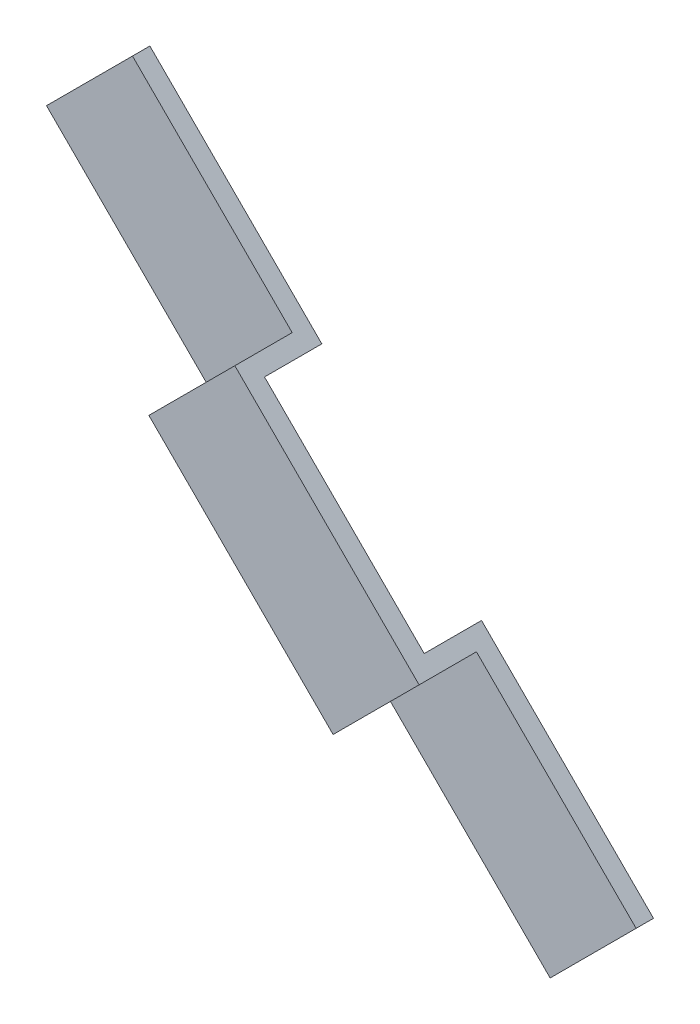
ISO-10303-21;
HEADER;
FILE_DESCRIPTION(('STEP AP214'),'2;1');
FILE_NAME('part.step','',(''),(''),'','','');
FILE_SCHEMA(('AUTOMOTIVE_DESIGN { 1 0 10303 214 1 1 1 1 }'));
ENDSEC;
DATA;
#1=APPLICATION_CONTEXT('core data for automotive mechanical design processes');
#2=APPLICATION_PROTOCOL_DEFINITION('international standard','automotive_design',2000,#1);
#3=PRODUCT_CONTEXT('',#1,'mechanical');
#4=PRODUCT('Part','Part','',(#3));
#5=PRODUCT_RELATED_PRODUCT_CATEGORY('part','',(#4));
#6=PRODUCT_DEFINITION_FORMATION('','',#4);
#7=PRODUCT_DEFINITION_CONTEXT('part definition',#1,'design');
#8=PRODUCT_DEFINITION('design','',#6,#7);
#9=PRODUCT_DEFINITION_SHAPE('','',#8);
#10=(LENGTH_UNIT() NAMED_UNIT(*) SI_UNIT(.MILLI.,.METRE.));
#11=(NAMED_UNIT(*) PLANE_ANGLE_UNIT() SI_UNIT($,.RADIAN.));
#12=(NAMED_UNIT(*) SI_UNIT($,.STERADIAN.) SOLID_ANGLE_UNIT());
#13=UNCERTAINTY_MEASURE_WITH_UNIT(LENGTH_MEASURE(1.E-05),#10,'distance_accuracy_value','');
#14=(GEOMETRIC_REPRESENTATION_CONTEXT(3) GLOBAL_UNCERTAINTY_ASSIGNED_CONTEXT((#13)) GLOBAL_UNIT_ASSIGNED_CONTEXT((#10,
#11,#12)) REPRESENTATION_CONTEXT('',''));
#15=CARTESIAN_POINT('',(0.,0.,0.));
#16=DIRECTION('',(0.,0.,1.));
#17=DIRECTION('',(1.,0.,0.));
#18=AXIS2_PLACEMENT_3D('',#15,#16,#17);
#19=CARTESIAN_POINT('',(-10.7809065038693,-13.3028898857297,2.41331608762142));
#20=CARTESIAN_POINT('',(-10.1869368076726,-12.708920189533,2.41331608762142));
#21=CARTESIAN_POINT('',(-10.7809065161091,-13.3028898734899,2.01731608762142));
#22=CARTESIAN_POINT('',(-10.1869368199124,-12.7089201772932,2.01731608762142));
#23=(BOUNDED_SURFACE() B_SPLINE_SURFACE(1,1,((#19,#20),(#21,#22)),.UNSPECIFIED.,.F.,.F.,
.F.) B_SPLINE_SURFACE_WITH_KNOTS((2,2),(2,2),(-3.3E-05,0.000363),(-7.0000000000072E-05,
0.00076999999999996),
.UNSPECIFIED.) GEOMETRIC_REPRESENTATION_ITEM() RATIONAL_B_SPLINE_SURFACE(((1.,1.),(1.,1.))) REPRESENTATION_ITEM('') SURFACE());
#24=CARTESIAN_POINT('',(-10.7314090404061,-13.2533923998268,2.05031608762142));
#25=CARTESIAN_POINT('',(-10.7314090302062,-13.2533924100266,2.38031608762142));
#26=(BOUNDED_CURVE() B_SPLINE_CURVE(1,(#24,#25),.UNSPECIFIED.,.F.,
.F.) B_SPLINE_CURVE_WITH_KNOTS((2,2),(0.,0.00033),
.UNSPECIFIED.) CURVE() GEOMETRIC_REPRESENTATION_ITEM() RATIONAL_B_SPLINE_CURVE((1.,1.)) REPRESENTATION_ITEM(''));
#27=CARTESIAN_POINT('',(-10.7314090404061,-13.2533923998268,2.05031608762142));
#28=VERTEX_POINT('',#27);
#29=CARTESIAN_POINT('',(-10.7314090302062,-13.2533924100266,2.38031608762142));
#30=VERTEX_POINT('',#29);
#31=EDGE_CURVE('E204',#28,#30,#26,.T.);
#32=CARTESIAN_POINT('',(-10.7314090404061,-13.2533923998268,2.05031608762142));
#33=CARTESIAN_POINT('',(-10.2364342935755,-12.7584176529962,2.05031608762142));
#34=(BOUNDED_CURVE() B_SPLINE_CURVE(1,(#32,#33),.UNSPECIFIED.,.F.,
.F.) B_SPLINE_CURVE_WITH_KNOTS((2,2),(0.,0.000700000000000023),
.UNSPECIFIED.) CURVE() GEOMETRIC_REPRESENTATION_ITEM() RATIONAL_B_SPLINE_CURVE((1.,1.)) REPRESENTATION_ITEM(''));
#35=CARTESIAN_POINT('',(-10.2364342935755,-12.7584176529962,2.05031608762142));
#36=VERTEX_POINT('',#35);
#37=EDGE_CURVE('E330',#28,#36,#34,.T.);
#38=CARTESIAN_POINT('',(-10.2364342833757,-12.758417663196,2.38031608762142));
#39=CARTESIAN_POINT('',(-10.2364342935755,-12.7584176529962,2.05031608762142));
#40=(BOUNDED_CURVE() B_SPLINE_CURVE(1,(#38,#39),.UNSPECIFIED.,.F.,
.F.) B_SPLINE_CURVE_WITH_KNOTS((2,2),(-0.00033,0.),
.UNSPECIFIED.) CURVE() GEOMETRIC_REPRESENTATION_ITEM() RATIONAL_B_SPLINE_CURVE((1.,1.)) REPRESENTATION_ITEM(''));
#41=CARTESIAN_POINT('',(-10.2364342833757,-12.758417663196,2.38031608762142));
#42=VERTEX_POINT('',#41);
#43=EDGE_CURVE('E115',#42,#36,#40,.T.);
#44=CARTESIAN_POINT('',(-10.7314090302062,-13.2533924100266,2.38031608762142));
#45=CARTESIAN_POINT('',(-10.2364342833757,-12.7584176631961,2.38031608762142));
#46=(BOUNDED_CURVE() B_SPLINE_CURVE(1,(#44,#45),.UNSPECIFIED.,.F.,
.F.) B_SPLINE_CURVE_WITH_KNOTS((2,2),(0.,0.000699999999999953),
.UNSPECIFIED.) CURVE() GEOMETRIC_REPRESENTATION_ITEM() RATIONAL_B_SPLINE_CURVE((1.,1.)) REPRESENTATION_ITEM(''));
#47=EDGE_CURVE('E11',#30,#42,#46,.T.);
#48=ORIENTED_EDGE('',*,*,#31,.F.);
#49=ORIENTED_EDGE('',*,*,#37,.T.);
#50=ORIENTED_EDGE('',*,*,#43,.F.);
#51=ORIENTED_EDGE('',*,*,#47,.F.);
#52=EDGE_LOOP('',(#48,#49,#50,#51));
#53=FACE_BOUND('',#52,.T.);
#54=ADVANCED_FACE('F17',(#53),#23,.T.);
#55=CARTESIAN_POINT('',(-9.76974380779254,-14.3140525818064,2.3803160251141));
#56=CARTESIAN_POINT('',(-9.17577411159583,-13.7200828856097,2.3803160251141));
#57=CARTESIAN_POINT('',(-10.8728303864436,-13.2109660031554,2.3803160933039));
#58=CARTESIAN_POINT('',(-10.2788606902469,-12.6169963069587,2.3803160933039));
#59=(BOUNDED_SURFACE() B_SPLINE_SURFACE(1,1,((#55,#56),(#57,#58)),.UNSPECIFIED.,.F.,.F.,
.F.) B_SPLINE_SURFACE_WITH_KNOTS((2,2),(2,2),(-0.000130000000000005,0.00143000000000004),
(-7.0000000000001E-05,0.000770000000000011),
.UNSPECIFIED.) GEOMETRIC_REPRESENTATION_ITEM() RATIONAL_B_SPLINE_SURFACE(((1.,1.),(1.,1.))) REPRESENTATION_ITEM('') SURFACE());
#60=CARTESIAN_POINT('',(-10.7314090302062,-13.2533924100266,2.38031608762142));
#61=CARTESIAN_POINT('',(-9.81217021466372,-14.1726312255691,2.38031603079659));
#62=(BOUNDED_CURVE() B_SPLINE_CURVE(1,(#60,#61),.UNSPECIFIED.,.F.,
.F.) B_SPLINE_CURVE_WITH_KNOTS((2,2),(0.,0.00129999999999996),
.UNSPECIFIED.) CURVE() GEOMETRIC_REPRESENTATION_ITEM() RATIONAL_B_SPLINE_CURVE((1.,1.)) REPRESENTATION_ITEM(''));
#63=CARTESIAN_POINT('',(-9.81217021466373,-14.1726312255691,2.38031603079658));
#64=VERTEX_POINT('',#63);
#65=EDGE_CURVE('E194',#30,#64,#62,.T.);
#66=CARTESIAN_POINT('',(-9.31719546783318,-13.6776564787385,2.38031603079659));
#67=CARTESIAN_POINT('',(-10.2364342833757,-12.758417663196,2.38031608762142));
#68=(BOUNDED_CURVE() B_SPLINE_CURVE(1,(#66,#67),.UNSPECIFIED.,.F.,
.F.) B_SPLINE_CURVE_WITH_KNOTS((2,2),(-0.00130000000000002,0.),
.UNSPECIFIED.) CURVE() GEOMETRIC_REPRESENTATION_ITEM() RATIONAL_B_SPLINE_CURVE((1.,1.)) REPRESENTATION_ITEM(''));
#69=CARTESIAN_POINT('',(-9.31719546783315,-13.6776564787385,2.38031603079658));
#70=VERTEX_POINT('',#69);
#71=EDGE_CURVE('E23',#70,#42,#68,.T.);
#72=CARTESIAN_POINT('',(-9.81217021466373,-14.1726312255691,2.38031603079658));
#73=CARTESIAN_POINT('',(-9.31719546783314,-13.6776564787385,2.38031603079658));
#74=(BOUNDED_CURVE() B_SPLINE_CURVE(1,(#72,#73),.UNSPECIFIED.,.F.,
.F.) B_SPLINE_CURVE_WITH_KNOTS((2,2),(0.,0.000700000000000009),
.UNSPECIFIED.) CURVE() GEOMETRIC_REPRESENTATION_ITEM() RATIONAL_B_SPLINE_CURVE((1.,1.)) REPRESENTATION_ITEM(''));
#75=EDGE_CURVE('E32',#64,#70,#74,.T.);
#76=ORIENTED_EDGE('',*,*,#65,.F.);
#77=ORIENTED_EDGE('',*,*,#47,.T.);
#78=ORIENTED_EDGE('',*,*,#71,.F.);
#79=ORIENTED_EDGE('',*,*,#75,.F.);
#80=EDGE_LOOP('',(#76,#77,#78,#79));
#81=FACE_BOUND('',#80,.T.);
#82=ADVANCED_FACE('F110',(#81),#59,.T.);
#83=CARTESIAN_POINT('',(-9.86166770056663,-14.2221286890324,2.01731603079658));
#84=CARTESIAN_POINT('',(-9.26769800436989,-13.6281589928356,2.01731603079658));
#85=CARTESIAN_POINT('',(-9.86166768832681,-14.2221287012722,2.41331603079658));
#86=CARTESIAN_POINT('',(-9.26769799213007,-13.6281590050755,2.41331603079658));
#87=(BOUNDED_SURFACE() B_SPLINE_SURFACE(1,1,((#83,#84),(#85,#86)),.UNSPECIFIED.,.F.,.F.,
.F.) B_SPLINE_SURFACE_WITH_KNOTS((2,2),(2,2),(-3.30000000000005E-05,0.000363),
(-7.00000000000048E-05,0.000770000000000053),
.UNSPECIFIED.) GEOMETRIC_REPRESENTATION_ITEM() RATIONAL_B_SPLINE_SURFACE(((1.,1.),(1.,1.))) REPRESENTATION_ITEM('') SURFACE());
#88=CARTESIAN_POINT('',(-9.81217021466373,-14.1726312255691,2.38031603079658));
#89=CARTESIAN_POINT('',(-9.81217022486358,-14.1726312153692,2.05031603079658));
#90=(BOUNDED_CURVE() B_SPLINE_CURVE(1,(#88,#89),.UNSPECIFIED.,.F.,
.F.) B_SPLINE_CURVE_WITH_KNOTS((2,2),(0.,0.00033),
.UNSPECIFIED.) CURVE() GEOMETRIC_REPRESENTATION_ITEM() RATIONAL_B_SPLINE_CURVE((1.,1.)) REPRESENTATION_ITEM(''));
#91=CARTESIAN_POINT('',(-9.81217022486358,-14.1726312153693,2.05031603079658));
#92=VERTEX_POINT('',#91);
#93=EDGE_CURVE('E102',#64,#92,#90,.T.);
#94=CARTESIAN_POINT('',(-9.317195478033,-13.6776564685387,2.05031603079658));
#95=CARTESIAN_POINT('',(-9.31719546783315,-13.6776564787385,2.38031603079658));
#96=(BOUNDED_CURVE() B_SPLINE_CURVE(1,(#94,#95),.UNSPECIFIED.,.F.,
.F.) B_SPLINE_CURVE_WITH_KNOTS((2,2),(-0.00033,0.),
.UNSPECIFIED.) CURVE() GEOMETRIC_REPRESENTATION_ITEM() RATIONAL_B_SPLINE_CURVE((1.,1.)) REPRESENTATION_ITEM(''));
#97=CARTESIAN_POINT('',(-9.31719547803299,-13.6776564685387,2.05031603079658));
#98=VERTEX_POINT('',#97);
#99=EDGE_CURVE('E99',#98,#70,#96,.T.);
#100=CARTESIAN_POINT('',(-9.81217022486358,-14.1726312153693,2.05031603079658));
#101=CARTESIAN_POINT('',(-9.31719547803299,-13.6776564685387,2.05031603079658));
#102=(BOUNDED_CURVE() B_SPLINE_CURVE(1,(#100,#101),.UNSPECIFIED.,.F.,
.F.) B_SPLINE_CURVE_WITH_KNOTS((2,2),(0.,0.000700000000000015),
.UNSPECIFIED.) CURVE() GEOMETRIC_REPRESENTATION_ITEM() RATIONAL_B_SPLINE_CURVE((1.,1.)) REPRESENTATION_ITEM(''));
#103=EDGE_CURVE('E107',#92,#98,#102,.T.);
#104=ORIENTED_EDGE('',*,*,#93,.F.);
#105=ORIENTED_EDGE('',*,*,#75,.T.);
#106=ORIENTED_EDGE('',*,*,#99,.F.);
#107=ORIENTED_EDGE('',*,*,#103,.F.);
#108=EDGE_LOOP('',(#104,#105,#106,#107));
#109=FACE_BOUND('',#108,.T.);
#110=ADVANCED_FACE('F97',(#109),#87,.T.);
#111=CARTESIAN_POINT('',(-8.77272325651935,-15.3110731330797,2.05031596348102));
#112=CARTESIAN_POINT('',(-8.17875356032262,-14.717103436883,2.05031596348102));
#113=CARTESIAN_POINT('',(-9.96066264891278,-14.1231337406863,2.05031603691619));
#114=CARTESIAN_POINT('',(-9.36669295271605,-13.5291640444895,2.05031603691619));
#115=(BOUNDED_SURFACE() B_SPLINE_SURFACE(1,1,((#111,#112),(#113,#114)),.UNSPECIFIED.,.F.,.F.,
.F.) B_SPLINE_SURFACE_WITH_KNOTS((2,2),(2,2),(-0.000140000000000004,0.00154000000000004),
(-7.00000000000037E-05,0.000770000000000041),
.UNSPECIFIED.) GEOMETRIC_REPRESENTATION_ITEM() RATIONAL_B_SPLINE_SURFACE(((1.,1.),(1.,1.))) REPRESENTATION_ITEM('') SURFACE());
#116=CARTESIAN_POINT('',(-9.81217022486358,-14.1726312153693,2.05031603079658));
#117=CARTESIAN_POINT('',(-8.8222207312024,-15.1625807090305,2.05031596960061));
#118=(BOUNDED_CURVE() B_SPLINE_CURVE(1,(#116,#117),.UNSPECIFIED.,.F.,
.F.) B_SPLINE_CURVE_WITH_KNOTS((2,2),(0.,0.00140000000000003),
.UNSPECIFIED.) CURVE() GEOMETRIC_REPRESENTATION_ITEM() RATIONAL_B_SPLINE_CURVE((1.,1.)) REPRESENTATION_ITEM(''));
#119=CARTESIAN_POINT('',(-8.82222073120241,-15.1625807090305,2.05031596960062));
#120=VERTEX_POINT('',#119);
#121=EDGE_CURVE('E193',#92,#120,#118,.T.);
#122=CARTESIAN_POINT('',(-8.32724598437181,-14.6676059621999,2.05031596960061));
#123=CARTESIAN_POINT('',(-9.31719547803299,-13.6776564685387,2.05031603079658));
#124=(BOUNDED_CURVE() B_SPLINE_CURVE(1,(#122,#123),.UNSPECIFIED.,.F.,
.F.) B_SPLINE_CURVE_WITH_KNOTS((2,2),(-0.00140000000000002,0.),
.UNSPECIFIED.) CURVE() GEOMETRIC_REPRESENTATION_ITEM() RATIONAL_B_SPLINE_CURVE((1.,1.)) REPRESENTATION_ITEM(''));
#125=CARTESIAN_POINT('',(-8.32724598437183,-14.6676059621999,2.05031596960062));
#126=VERTEX_POINT('',#125);
#127=EDGE_CURVE('E120',#126,#98,#124,.T.);
#128=CARTESIAN_POINT('',(-8.82222073120241,-15.1625807090305,2.05031596960062));
#129=CARTESIAN_POINT('',(-8.32724598437182,-14.6676059621999,2.05031596960062));
#130=(BOUNDED_CURVE() B_SPLINE_CURVE(1,(#128,#129),.UNSPECIFIED.,.F.,
.F.) B_SPLINE_CURVE_WITH_KNOTS((2,2),(0.,0.000700000000000011),
.UNSPECIFIED.) CURVE() GEOMETRIC_REPRESENTATION_ITEM() RATIONAL_B_SPLINE_CURVE((1.,1.)) REPRESENTATION_ITEM(''));
#131=EDGE_CURVE('E251',#120,#126,#130,.T.);
#132=ORIENTED_EDGE('',*,*,#121,.F.);
#133=ORIENTED_EDGE('',*,*,#103,.T.);
#134=ORIENTED_EDGE('',*,*,#127,.F.);
#135=ORIENTED_EDGE('',*,*,#131,.F.);
#136=EDGE_LOOP('',(#132,#133,#134,#135));
#137=FACE_BOUND('',#136,.T.);
#138=ADVANCED_FACE('F368',(#137),#115,.T.);
#139=CARTESIAN_POINT('',(-8.87171820248556,-15.2120781871135,2.16031596960061));
#140=CARTESIAN_POINT('',(-8.27774850628881,-14.6181084909167,2.16031596960061));
#141=CARTESIAN_POINT('',(-8.87171820619459,-15.2120781834044,2.04031596960062));
#142=CARTESIAN_POINT('',(-8.27774850999784,-14.6181084872077,2.04031596960062));
#143=(BOUNDED_SURFACE() B_SPLINE_SURFACE(1,1,((#139,#140),(#141,#142)),.UNSPECIFIED.,.F.,.F.,
.F.) B_SPLINE_SURFACE_WITH_KNOTS((2,2),(2,2),(-9.99999999999916E-06,0.00010999999999999),
(-7.00000000000501E-05,0.000770000000000023),
.UNSPECIFIED.) GEOMETRIC_REPRESENTATION_ITEM() RATIONAL_B_SPLINE_SURFACE(((1.,1.),(1.,1.))) REPRESENTATION_ITEM('') SURFACE());
#144=CARTESIAN_POINT('',(-8.82222073120241,-15.1625807090305,2.05031596960062));
#145=CARTESIAN_POINT('',(-8.82222072811155,-15.1625807121214,2.15031596960061));
#146=(BOUNDED_CURVE() B_SPLINE_CURVE(1,(#144,#145),.UNSPECIFIED.,.F.,
.F.) B_SPLINE_CURVE_WITH_KNOTS((2,2),(0.,9.99999999999904E-05),
.UNSPECIFIED.) CURVE() GEOMETRIC_REPRESENTATION_ITEM() RATIONAL_B_SPLINE_CURVE((1.,1.)) REPRESENTATION_ITEM(''));
#147=CARTESIAN_POINT('',(-8.82222072811155,-15.1625807121213,2.15031596960061));
#148=VERTEX_POINT('',#147);
#149=EDGE_CURVE('E144',#120,#148,#146,.T.);
#150=CARTESIAN_POINT('',(-8.32724598128097,-14.6676059652908,2.15031596960061));
#151=CARTESIAN_POINT('',(-8.32724598437183,-14.6676059621999,2.05031596960062));
#152=(BOUNDED_CURVE() B_SPLINE_CURVE(1,(#150,#151),.UNSPECIFIED.,.F.,
.F.) B_SPLINE_CURVE_WITH_KNOTS((2,2),(-9.99999999999904E-05,0.),
.UNSPECIFIED.) CURVE() GEOMETRIC_REPRESENTATION_ITEM() RATIONAL_B_SPLINE_CURVE((1.,1.)) REPRESENTATION_ITEM(''));
#153=CARTESIAN_POINT('',(-8.32724598128096,-14.6676059652907,2.15031596960061));
#154=VERTEX_POINT('',#153);
#155=EDGE_CURVE('E127',#154,#126,#152,.T.);
#156=CARTESIAN_POINT('',(-8.82222072811155,-15.1625807121213,2.15031596960061));
#157=CARTESIAN_POINT('',(-8.32724598128095,-14.6676059652907,2.15031596960061));
#158=(BOUNDED_CURVE() B_SPLINE_CURVE(1,(#156,#157),.UNSPECIFIED.,.F.,
.F.) B_SPLINE_CURVE_WITH_KNOTS((2,2),(0.,0.000700000000000016),
.UNSPECIFIED.) CURVE() GEOMETRIC_REPRESENTATION_ITEM() RATIONAL_B_SPLINE_CURVE((1.,1.)) REPRESENTATION_ITEM(''));
#159=EDGE_CURVE('E175',#148,#154,#158,.T.);
#160=ORIENTED_EDGE('',*,*,#149,.F.);
#161=ORIENTED_EDGE('',*,*,#131,.T.);
#162=ORIENTED_EDGE('',*,*,#155,.F.);
#163=ORIENTED_EDGE('',*,*,#159,.F.);
#164=EDGE_LOOP('',(#160,#161,#162,#163));
#165=FACE_BOUND('',#164,.T.);
#166=ADVANCED_FACE('F19',(#165),#143,.T.);
#167=CARTESIAN_POINT('',(-9.88288089989138,-14.2009154897076,2.15031603210792));
#168=CARTESIAN_POINT('',(-9.28891120369465,-13.6069457935109,2.15031603210792));
#169=CARTESIAN_POINT('',(-8.77979432124037,-15.3040020683586,2.15031596391812));
#170=CARTESIAN_POINT('',(-8.18582462504364,-14.7100323721619,2.15031596391812));
#171=(BOUNDED_SURFACE() B_SPLINE_SURFACE(1,1,((#167,#168),(#169,#170)),.UNSPECIFIED.,.F.,.F.,
.F.) B_SPLINE_SURFACE_WITH_KNOTS((2,2),(2,2),(-0.000130000000000008,0.00143),
(-7.00000000000026E-05,0.000770000000000029),
.UNSPECIFIED.) GEOMETRIC_REPRESENTATION_ITEM() RATIONAL_B_SPLINE_SURFACE(((1.,1.),(1.,1.))) REPRESENTATION_ITEM('') SURFACE());
#172=CARTESIAN_POINT('',(-8.82222072811155,-15.1625807121213,2.15031596960061));
#173=CARTESIAN_POINT('',(-9.74145954365405,-14.2433418965788,2.15031602642544));
#174=(BOUNDED_CURVE() B_SPLINE_CURVE(1,(#172,#173),.UNSPECIFIED.,.F.,
.F.) B_SPLINE_CURVE_WITH_KNOTS((2,2),(0.,0.0013),
.UNSPECIFIED.) CURVE() GEOMETRIC_REPRESENTATION_ITEM() RATIONAL_B_SPLINE_CURVE((1.,1.)) REPRESENTATION_ITEM(''));
#175=CARTESIAN_POINT('',(-9.74145954365406,-14.2433418965788,2.15031602642544));
#176=VERTEX_POINT('',#175);
#177=EDGE_CURVE('E136',#148,#176,#174,.T.);
#178=CARTESIAN_POINT('',(-9.24648479682346,-13.7483671497482,2.15031602642544));
#179=CARTESIAN_POINT('',(-8.32724598128096,-14.6676059652907,2.15031596960061));
#180=(BOUNDED_CURVE() B_SPLINE_CURVE(1,(#178,#179),.UNSPECIFIED.,.F.,
.F.) B_SPLINE_CURVE_WITH_KNOTS((2,2),(-0.0013,0.),
.UNSPECIFIED.) CURVE() GEOMETRIC_REPRESENTATION_ITEM() RATIONAL_B_SPLINE_CURVE((1.,1.)) REPRESENTATION_ITEM(''));
#181=CARTESIAN_POINT('',(-9.24648479682347,-13.7483671497482,2.15031602642544));
#182=VERTEX_POINT('',#181);
#183=EDGE_CURVE('E241',#182,#154,#180,.T.);
#184=CARTESIAN_POINT('',(-9.74145954365406,-14.2433418965788,2.15031602642544));
#185=CARTESIAN_POINT('',(-9.24648479682346,-13.7483671497482,2.15031602642544));
#186=(BOUNDED_CURVE() B_SPLINE_CURVE(1,(#184,#185),.UNSPECIFIED.,.F.,
.F.) B_SPLINE_CURVE_WITH_KNOTS((2,2),(0.,0.000700000000000018),
.UNSPECIFIED.) CURVE() GEOMETRIC_REPRESENTATION_ITEM() RATIONAL_B_SPLINE_CURVE((1.,1.)) REPRESENTATION_ITEM(''));
#187=EDGE_CURVE('E167',#176,#182,#186,.T.);
#188=ORIENTED_EDGE('',*,*,#177,.F.);
#189=ORIENTED_EDGE('',*,*,#159,.T.);
#190=ORIENTED_EDGE('',*,*,#183,.F.);
#191=ORIENTED_EDGE('',*,*,#187,.F.);
#192=EDGE_LOOP('',(#188,#189,#190,#191));
#193=FACE_BOUND('',#192,.T.);
#194=ADVANCED_FACE('F373',(#193),#171,.T.);
#195=CARTESIAN_POINT('',(-9.79095700711731,-14.2928393824817,2.51331602642544));
#196=CARTESIAN_POINT('',(-9.19698731092059,-13.698869686285,2.51331602642544));
#197=CARTESIAN_POINT('',(-9.79095701935713,-14.2928393702419,2.11731602642544));
#198=CARTESIAN_POINT('',(-9.19698732316041,-13.6988696740451,2.11731602642544));
#199=(BOUNDED_SURFACE() B_SPLINE_SURFACE(1,1,((#195,#196),(#197,#198)),.UNSPECIFIED.,.F.,.F.,
.F.) B_SPLINE_SURFACE_WITH_KNOTS((2,2),(2,2),(-3.3E-05,0.000363),(-7.00000000000393E-05,
0.000769999999999988),
.UNSPECIFIED.) GEOMETRIC_REPRESENTATION_ITEM() RATIONAL_B_SPLINE_SURFACE(((1.,1.),(1.,1.))) REPRESENTATION_ITEM('') SURFACE());
#200=CARTESIAN_POINT('',(-9.74145954365406,-14.2433418965788,2.15031602642544));
#201=CARTESIAN_POINT('',(-9.74145953345421,-14.2433419067786,2.48031602642544));
#202=(BOUNDED_CURVE() B_SPLINE_CURVE(1,(#200,#201),.UNSPECIFIED.,.F.,
.F.) B_SPLINE_CURVE_WITH_KNOTS((2,2),(0.,0.00033),
.UNSPECIFIED.) CURVE() GEOMETRIC_REPRESENTATION_ITEM() RATIONAL_B_SPLINE_CURVE((1.,1.)) REPRESENTATION_ITEM(''));
#203=CARTESIAN_POINT('',(-9.74145953345421,-14.2433419067786,2.48031602642544));
#204=VERTEX_POINT('',#203);
#205=EDGE_CURVE('E133',#176,#204,#202,.T.);
#206=CARTESIAN_POINT('',(-9.24648478662362,-13.748367159948,2.48031602642544));
#207=CARTESIAN_POINT('',(-9.24648479682347,-13.7483671497482,2.15031602642544));
#208=(BOUNDED_CURVE() B_SPLINE_CURVE(1,(#206,#207),.UNSPECIFIED.,.F.,
.F.) B_SPLINE_CURVE_WITH_KNOTS((2,2),(-0.00033,0.),
.UNSPECIFIED.) CURVE() GEOMETRIC_REPRESENTATION_ITEM() RATIONAL_B_SPLINE_CURVE((1.,1.)) REPRESENTATION_ITEM(''));
#209=CARTESIAN_POINT('',(-9.24648478662363,-13.7483671599481,2.48031602642544));
#210=VERTEX_POINT('',#209);
#211=EDGE_CURVE('E232',#210,#182,#208,.T.);
#212=CARTESIAN_POINT('',(-9.74145953345421,-14.2433419067786,2.48031602642544));
#213=CARTESIAN_POINT('',(-9.24648478662367,-13.7483671599481,2.48031602642544));
#214=(BOUNDED_CURVE() B_SPLINE_CURVE(1,(#212,#213),.UNSPECIFIED.,.F.,
.F.) B_SPLINE_CURVE_WITH_KNOTS((2,2),(0.,0.000699999999999939),
.UNSPECIFIED.) CURVE() GEOMETRIC_REPRESENTATION_ITEM() RATIONAL_B_SPLINE_CURVE((1.,1.)) REPRESENTATION_ITEM(''));
#215=EDGE_CURVE('E176',#204,#210,#214,.T.);
#216=ORIENTED_EDGE('',*,*,#205,.F.);
#217=ORIENTED_EDGE('',*,*,#187,.T.);
#218=ORIENTED_EDGE('',*,*,#211,.F.);
#219=ORIENTED_EDGE('',*,*,#215,.F.);
#220=EDGE_LOOP('',(#216,#217,#218,#219));
#221=FACE_BOUND('',#220,.T.);
#222=ADVANCED_FACE('F526',(#221),#199,.T.);
#223=CARTESIAN_POINT('',(-10.957683197095,-13.1261131925039,2.48031609854927));
#224=CARTESIAN_POINT('',(-10.3637135008983,-12.5321434963072,2.48031609854927));
#225=CARTESIAN_POINT('',(-9.68489099095925,-14.3989053986397,2.48031601986873));
#226=CARTESIAN_POINT('',(-9.09092129476252,-13.804935702443,2.48031601986873));
#227=(BOUNDED_SURFACE() B_SPLINE_SURFACE(1,1,((#223,#224),(#225,#226)),.UNSPECIFIED.,.F.,.F.,
.F.) B_SPLINE_SURFACE_WITH_KNOTS((2,2),(2,2),(-0.000150000000000003,0.00165),
(-7.00000000000096E-05,0.00077000000000003),
.UNSPECIFIED.) GEOMETRIC_REPRESENTATION_ITEM() RATIONAL_B_SPLINE_SURFACE(((1.,1.),(1.,1.))) REPRESENTATION_ITEM('') SURFACE());
#228=CARTESIAN_POINT('',(-9.74145953345421,-14.2433419067786,2.48031602642544));
#229=CARTESIAN_POINT('',(-10.802119705234,-13.1826817349988,2.48031609199256));
#230=(BOUNDED_CURVE() B_SPLINE_CURVE(1,(#228,#229),.UNSPECIFIED.,.F.,
.F.) B_SPLINE_CURVE_WITH_KNOTS((2,2),(0.,0.00149999999999996),
.UNSPECIFIED.) CURVE() GEOMETRIC_REPRESENTATION_ITEM() RATIONAL_B_SPLINE_CURVE((1.,1.)) REPRESENTATION_ITEM(''));
#231=CARTESIAN_POINT('',(-10.802119705234,-13.1826817349988,2.48031609199256));
#232=VERTEX_POINT('',#231);
#233=EDGE_CURVE('E824',#204,#232,#230,.T.);
#234=CARTESIAN_POINT('',(-10.3071449584035,-12.6877069881683,2.48031609199256));
#235=CARTESIAN_POINT('',(-9.24648478662363,-13.7483671599481,2.48031602642544));
#236=(BOUNDED_CURVE() B_SPLINE_CURVE(1,(#234,#235),.UNSPECIFIED.,.F.,
.F.) B_SPLINE_CURVE_WITH_KNOTS((2,2),(-0.0015,0.),
.UNSPECIFIED.) CURVE() GEOMETRIC_REPRESENTATION_ITEM() RATIONAL_B_SPLINE_CURVE((1.,1.)) REPRESENTATION_ITEM(''));
#237=CARTESIAN_POINT('',(-10.3071449584034,-12.6877069881682,2.48031609199256));
#238=VERTEX_POINT('',#237);
#239=EDGE_CURVE('E242',#238,#210,#236,.T.);
#240=CARTESIAN_POINT('',(-10.802119705234,-13.1826817349988,2.48031609199256));
#241=CARTESIAN_POINT('',(-10.3071449584034,-12.6877069881682,2.48031609199256));
#242=(BOUNDED_CURVE() B_SPLINE_CURVE(1,(#240,#241),.UNSPECIFIED.,.F.,
.F.) B_SPLINE_CURVE_WITH_KNOTS((2,2),(0.,0.000700000000000025),
.UNSPECIFIED.) CURVE() GEOMETRIC_REPRESENTATION_ITEM() RATIONAL_B_SPLINE_CURVE((1.,1.)) REPRESENTATION_ITEM(''));
#243=EDGE_CURVE('E231',#232,#238,#242,.T.);
#244=ORIENTED_EDGE('',*,*,#233,.F.);
#245=ORIENTED_EDGE('',*,*,#215,.T.);
#246=ORIENTED_EDGE('',*,*,#239,.F.);
#247=ORIENTED_EDGE('',*,*,#243,.F.);
#248=EDGE_LOOP('',(#244,#245,#246,#247));
#249=FACE_BOUND('',#248,.T.);
#250=ADVANCED_FACE('F496',(#249),#227,.T.);
#251=CARTESIAN_POINT('',(-10.8516171911369,-13.2321791984621,2.11731609199256));
#252=CARTESIAN_POINT('',(-10.2576474949402,-12.6382095022653,2.11731609199256));
#253=CARTESIAN_POINT('',(-10.8516171788971,-13.2321792107019,2.51331609199256));
#254=CARTESIAN_POINT('',(-10.2576474827004,-12.6382095145051,2.51331609199256));
#255=(BOUNDED_SURFACE() B_SPLINE_SURFACE(1,1,((#251,#252),(#253,#254)),.UNSPECIFIED.,.F.,.F.,
.F.) B_SPLINE_SURFACE_WITH_KNOTS((2,2),(2,2),(-3.30000000000005E-05,0.000363),
(-7.00000000000094E-05,0.000770000000000104),
.UNSPECIFIED.) GEOMETRIC_REPRESENTATION_ITEM() RATIONAL_B_SPLINE_SURFACE(((1.,1.),(1.,1.))) REPRESENTATION_ITEM('') SURFACE());
#256=CARTESIAN_POINT('',(-10.802119705234,-13.1826817349988,2.48031609199256));
#257=CARTESIAN_POINT('',(-10.8021197154339,-13.182681724799,2.15031609199256));
#258=(BOUNDED_CURVE() B_SPLINE_CURVE(1,(#256,#257),.UNSPECIFIED.,.F.,
.F.) B_SPLINE_CURVE_WITH_KNOTS((2,2),(0.,0.00033),
.UNSPECIFIED.) CURVE() GEOMETRIC_REPRESENTATION_ITEM() RATIONAL_B_SPLINE_CURVE((1.,1.)) REPRESENTATION_ITEM(''));
#259=CARTESIAN_POINT('',(-10.8021197154339,-13.182681724799,2.15031609199256));
#260=VERTEX_POINT('',#259);
#261=EDGE_CURVE('E160',#232,#260,#258,.T.);
#262=CARTESIAN_POINT('',(-10.3071449686033,-12.6877069779684,2.15031609199256));
#263=CARTESIAN_POINT('',(-10.3071449584034,-12.6877069881682,2.48031609199256));
#264=(BOUNDED_CURVE() B_SPLINE_CURVE(1,(#262,#263),.UNSPECIFIED.,.F.,
.F.) B_SPLINE_CURVE_WITH_KNOTS((2,2),(-0.00033,0.),
.UNSPECIFIED.) CURVE() GEOMETRIC_REPRESENTATION_ITEM() RATIONAL_B_SPLINE_CURVE((1.,1.)) REPRESENTATION_ITEM(''));
#265=CARTESIAN_POINT('',(-10.3071449686033,-12.6877069779684,2.15031609199256));
#266=VERTEX_POINT('',#265);
#267=EDGE_CURVE('E268',#266,#238,#264,.T.);
#268=CARTESIAN_POINT('',(-10.8021197154339,-13.182681724799,2.15031609199256));
#269=CARTESIAN_POINT('',(-10.3071449686033,-12.6877069779684,2.15031609199256));
#270=(BOUNDED_CURVE() B_SPLINE_CURVE(1,(#268,#269),.UNSPECIFIED.,.F.,
.F.) B_SPLINE_CURVE_WITH_KNOTS((2,2),(0.,0.000700000000000022),
.UNSPECIFIED.) CURVE() GEOMETRIC_REPRESENTATION_ITEM() RATIONAL_B_SPLINE_CURVE((1.,1.)) REPRESENTATION_ITEM(''));
#271=EDGE_CURVE('E223',#260,#266,#270,.T.);
#272=ORIENTED_EDGE('',*,*,#261,.F.);
#273=ORIENTED_EDGE('',*,*,#243,.T.);
#274=ORIENTED_EDGE('',*,*,#267,.F.);
#275=ORIENTED_EDGE('',*,*,#271,.F.);
#276=EDGE_LOOP('',(#272,#273,#274,#275));
#277=FACE_BOUND('',#276,.T.);
#278=ADVANCED_FACE('F490',(#277),#255,.T.);
#279=CARTESIAN_POINT('',(-11.8627798872137,-12.2210165023853,2.15031615449987));
#280=CARTESIAN_POINT('',(-11.268810191017,-11.6270468061886,2.15031615449987));
#281=CARTESIAN_POINT('',(-10.7596933085627,-13.3241030810363,2.15031608631007));
#282=CARTESIAN_POINT('',(-10.165723612366,-12.7301333848396,2.15031608631007));
#283=(BOUNDED_SURFACE() B_SPLINE_SURFACE(1,1,((#279,#280),(#281,#282)),.UNSPECIFIED.,.F.,.F.,
.F.) B_SPLINE_SURFACE_WITH_KNOTS((2,2),(2,2),(-0.00293,-0.00137),(-7.00000000000325E-05,
0.000770000000000014),
.UNSPECIFIED.) GEOMETRIC_REPRESENTATION_ITEM() RATIONAL_B_SPLINE_SURFACE(((1.,1.),(1.,1.))) REPRESENTATION_ITEM('') SURFACE());
#284=CARTESIAN_POINT('',(-10.8021197154339,-13.182681724799,2.15031609199257));
#285=CARTESIAN_POINT('',(-11.7213585309764,-12.2634429092565,2.1503161488174));
#286=(BOUNDED_CURVE() B_SPLINE_CURVE(1,(#284,#285),.UNSPECIFIED.,.F.,
.F.) B_SPLINE_CURVE_WITH_KNOTS((2,2),(0.000749999999999987,0.00204999999999997),
.UNSPECIFIED.) CURVE() GEOMETRIC_REPRESENTATION_ITEM() RATIONAL_B_SPLINE_CURVE((1.,1.)) REPRESENTATION_ITEM(''));
#287=CARTESIAN_POINT('',(-11.7213585309764,-12.2634429092565,2.1503161488174));
#288=VERTEX_POINT('',#287);
#289=EDGE_CURVE('E151',#260,#288,#286,.T.);
#290=CARTESIAN_POINT('',(-11.2263837841458,-11.7684681624259,2.1503161488174));
#291=CARTESIAN_POINT('',(-10.3071449686033,-12.6877069779684,2.15031609199257));
#292=(BOUNDED_CURVE() B_SPLINE_CURVE(1,(#290,#291),.UNSPECIFIED.,.F.,
.F.) B_SPLINE_CURVE_WITH_KNOTS((2,2),(-0.00205,-0.00075),
.UNSPECIFIED.) CURVE() GEOMETRIC_REPRESENTATION_ITEM() RATIONAL_B_SPLINE_CURVE((1.,1.)) REPRESENTATION_ITEM(''));
#293=CARTESIAN_POINT('',(-11.2263837841458,-11.7684681624259,2.1503161488174));
#294=VERTEX_POINT('',#293);
#295=EDGE_CURVE('E222',#294,#266,#292,.T.);
#296=CARTESIAN_POINT('',(-11.7213585309764,-12.2634429092565,2.1503161488174));
#297=CARTESIAN_POINT('',(-11.2263837841458,-11.7684681624259,2.1503161488174));
#298=(BOUNDED_CURVE() B_SPLINE_CURVE(1,(#296,#297),.UNSPECIFIED.,.F.,
.F.) B_SPLINE_CURVE_WITH_KNOTS((2,2),(0.,0.000700000000000023),
.UNSPECIFIED.) CURVE() GEOMETRIC_REPRESENTATION_ITEM() RATIONAL_B_SPLINE_CURVE((1.,1.)) REPRESENTATION_ITEM(''));
#299=EDGE_CURVE('E41',#288,#294,#298,.T.);
#300=ORIENTED_EDGE('',*,*,#289,.F.);
#301=ORIENTED_EDGE('',*,*,#271,.T.);
#302=ORIENTED_EDGE('',*,*,#295,.F.);
#303=ORIENTED_EDGE('',*,*,#299,.F.);
#304=EDGE_LOOP('',(#300,#301,#302,#303));
#305=FACE_BOUND('',#304,.T.);
#306=ADVANCED_FACE('F495',(#305),#283,.T.);
#307=CARTESIAN_POINT('',(-11.7708560090594,-12.3129403805396,2.04031614881739));
#308=CARTESIAN_POINT('',(-11.1768863128627,-11.7189706843429,2.04031614881739));
#309=CARTESIAN_POINT('',(-11.7708560053504,-12.3129403842487,2.1603161488174));
#310=CARTESIAN_POINT('',(-11.1768863091536,-11.7189706880519,2.1603161488174));
#311=(BOUNDED_SURFACE() B_SPLINE_SURFACE(1,1,((#307,#308),(#309,#310)),.UNSPECIFIED.,.F.,.F.,
.F.) B_SPLINE_SURFACE_WITH_KNOTS((2,2),(2,2),(-1.00000000000015E-05,0.000110000000000011),
(-7.0000000000073E-05,0.000769999999999955),
.UNSPECIFIED.) GEOMETRIC_REPRESENTATION_ITEM() RATIONAL_B_SPLINE_SURFACE(((1.,1.),(1.,1.))) REPRESENTATION_ITEM('') SURFACE());
#312=CARTESIAN_POINT('',(-11.7213585309764,-12.2634429092565,2.1503161488174));
#313=CARTESIAN_POINT('',(-11.7213585340673,-12.2634429061656,2.05031614881739));
#314=(BOUNDED_CURVE() B_SPLINE_CURVE(1,(#312,#313),.UNSPECIFIED.,.F.,
.F.) B_SPLINE_CURVE_WITH_KNOTS((2,2),(0.,0.00010000000000001),
.UNSPECIFIED.) CURVE() GEOMETRIC_REPRESENTATION_ITEM() RATIONAL_B_SPLINE_CURVE((1.,1.)) REPRESENTATION_ITEM(''));
#315=CARTESIAN_POINT('',(-11.7213585340672,-12.2634429061656,2.05031614881739));
#316=VERTEX_POINT('',#315);
#317=EDGE_CURVE('E159',#288,#316,#314,.T.);
#318=CARTESIAN_POINT('',(-11.2263837872367,-11.768468159335,2.05031614881739));
#319=CARTESIAN_POINT('',(-11.2263837841458,-11.7684681624259,2.1503161488174));
#320=(BOUNDED_CURVE() B_SPLINE_CURVE(1,(#318,#319),.UNSPECIFIED.,.F.,
.F.) B_SPLINE_CURVE_WITH_KNOTS((2,2),(-0.00010000000000001,0.),
.UNSPECIFIED.) CURVE() GEOMETRIC_REPRESENTATION_ITEM() RATIONAL_B_SPLINE_CURVE((1.,1.)) REPRESENTATION_ITEM(''));
#321=CARTESIAN_POINT('',(-11.2263837872367,-11.768468159335,2.05031614881739));
#322=VERTEX_POINT('',#321);
#323=EDGE_CURVE('E213',#322,#294,#320,.T.);
#324=CARTESIAN_POINT('',(-11.7213585340672,-12.2634429061656,2.05031614881739));
#325=CARTESIAN_POINT('',(-11.2263837872366,-11.7684681593351,2.05031614881739));
#326=(BOUNDED_CURVE() B_SPLINE_CURVE(1,(#324,#325),.UNSPECIFIED.,.F.,
.F.) B_SPLINE_CURVE_WITH_KNOTS((2,2),(0.,0.000699999999999951),
.UNSPECIFIED.) CURVE() GEOMETRIC_REPRESENTATION_ITEM() RATIONAL_B_SPLINE_CURVE((1.,1.)) REPRESENTATION_ITEM(''));
#327=EDGE_CURVE('E185',#316,#322,#326,.T.);
#328=ORIENTED_EDGE('',*,*,#317,.F.);
#329=ORIENTED_EDGE('',*,*,#299,.T.);
#330=ORIENTED_EDGE('',*,*,#323,.F.);
#331=ORIENTED_EDGE('',*,*,#327,.F.);
#332=EDGE_LOOP('',(#328,#329,#330,#331));
#333=FACE_BOUND('',#332,.T.);
#334=ADVANCED_FACE('F353',(#333),#311,.T.);
#335=CARTESIAN_POINT('',(-10.681911565723,-13.401884823876,2.05031608150183));
#336=CARTESIAN_POINT('',(-10.0879418695263,-12.8079151276792,2.05031608150183));
#337=CARTESIAN_POINT('',(-11.8698509581165,-12.2139454314825,2.05031615493699));
#338=CARTESIAN_POINT('',(-11.2758812619197,-11.6199757352858,2.05031615493699));
#339=(BOUNDED_SURFACE() B_SPLINE_SURFACE(1,1,((#335,#336),(#337,#338)),.UNSPECIFIED.,.F.,.F.,
.F.) B_SPLINE_SURFACE_WITH_KNOTS((2,2),(2,2),(0.00256,0.00424000000000008),(-7.E-05,
0.000770000000000079),
.UNSPECIFIED.) GEOMETRIC_REPRESENTATION_ITEM() RATIONAL_B_SPLINE_SURFACE(((1.,1.),(1.,1.))) REPRESENTATION_ITEM('') SURFACE());
#340=CARTESIAN_POINT('',(-11.7213585340672,-12.2634429061656,2.05031614881739));
#341=CARTESIAN_POINT('',(-10.731409040406,-13.2533923998267,2.05031608762142));
#342=(BOUNDED_CURVE() B_SPLINE_CURVE(1,(#340,#341),.UNSPECIFIED.,.F.,
.F.) B_SPLINE_CURVE_WITH_KNOTS((2,2),(-0.00204999999999997,-0.000649999999999991),
.UNSPECIFIED.) CURVE() GEOMETRIC_REPRESENTATION_ITEM() RATIONAL_B_SPLINE_CURVE((1.,1.)) REPRESENTATION_ITEM(''));
#343=EDGE_CURVE('E195',#316,#28,#342,.T.);
#344=CARTESIAN_POINT('',(-10.2364342935755,-12.7584176529962,2.05031608762143));
#345=CARTESIAN_POINT('',(-11.2263837872367,-11.768468159335,2.0503161488174));
#346=(BOUNDED_CURVE() B_SPLINE_CURVE(1,(#344,#345),.UNSPECIFIED.,.F.,
.F.) B_SPLINE_CURVE_WITH_KNOTS((2,2),(0.000649999999999965,0.00205),
.UNSPECIFIED.) CURVE() GEOMETRIC_REPRESENTATION_ITEM() RATIONAL_B_SPLINE_CURVE((1.,1.)) REPRESENTATION_ITEM(''));
#347=EDGE_CURVE('E205',#36,#322,#346,.T.);
#348=ORIENTED_EDGE('',*,*,#343,.F.);
#349=ORIENTED_EDGE('',*,*,#327,.T.);
#350=ORIENTED_EDGE('',*,*,#347,.F.);
#351=ORIENTED_EDGE('',*,*,#37,.F.);
#352=EDGE_LOOP('',(#348,#349,#350,#351));
#353=FACE_BOUND('',#352,.T.);
#354=ADVANCED_FACE('F346',(#353),#339,.T.);
#355=CARTESIAN_POINT('',(-12.011272299734,-11.9735291404989,2.52331616673907));
#356=CARTESIAN_POINT('',(-8.53230693629613,-15.4524945039368,2.52331595167893));
#357=CARTESIAN_POINT('',(-12.0112723156828,-11.9735291245501,2.00731616673906));
#358=CARTESIAN_POINT('',(-8.53230695224499,-15.4524944879879,2.00731595167893));
#359=(BOUNDED_SURFACE() B_SPLINE_SURFACE(1,1,((#355,#356),(#357,#358)),.UNSPECIFIED.,.F.,.F.,
.F.) B_SPLINE_SURFACE_WITH_KNOTS((2,2),(2,2),(-0.000210469135802014,0.000305530864197994),
(-0.00246,0.00246000000000003),
.UNSPECIFIED.) GEOMETRIC_REPRESENTATION_ITEM() RATIONAL_B_SPLINE_SURFACE(((1.,1.),(1.,1.))) REPRESENTATION_ITEM('') SURFACE());
#360=ORIENTED_EDGE('',*,*,#343,.T.);
#361=ORIENTED_EDGE('',*,*,#31,.T.);
#362=ORIENTED_EDGE('',*,*,#65,.T.);
#363=ORIENTED_EDGE('',*,*,#93,.T.);
#364=ORIENTED_EDGE('',*,*,#121,.T.);
#365=ORIENTED_EDGE('',*,*,#149,.T.);
#366=ORIENTED_EDGE('',*,*,#177,.T.);
#367=ORIENTED_EDGE('',*,*,#205,.T.);
#368=ORIENTED_EDGE('',*,*,#233,.T.);
#369=ORIENTED_EDGE('',*,*,#261,.T.);
#370=ORIENTED_EDGE('',*,*,#289,.T.);
#371=ORIENTED_EDGE('',*,*,#317,.T.);
#372=EDGE_LOOP('',(#360,#361,#362,#363,#364,#365,#366,#367,#368,#369,#370,#371));
#373=FACE_BOUND('',#372,.T.);
#374=ADVANCED_FACE('F537',(#373),#359,.T.);
#375=CARTESIAN_POINT('',(-11.5162975688523,-11.4785543777194,2.00731616673906));
#376=CARTESIAN_POINT('',(-8.0373322054144,-14.9575197411573,2.00731595167893));
#377=CARTESIAN_POINT('',(-11.5162975529034,-11.4785543936683,2.52331616673907));
#378=CARTESIAN_POINT('',(-8.03733218946555,-14.9575197571062,2.52331595167893));
#379=(BOUNDED_SURFACE() B_SPLINE_SURFACE(1,1,((#375,#376),(#377,#378)),.UNSPECIFIED.,.F.,.F.,
.F.) B_SPLINE_SURFACE_WITH_KNOTS((2,2),(2,2),(-0.000210469135802014,0.000305530864197994),
(-0.00246000000000005,0.00246),
.UNSPECIFIED.) GEOMETRIC_REPRESENTATION_ITEM() RATIONAL_B_SPLINE_SURFACE(((1.,1.),(1.,1.))) REPRESENTATION_ITEM('') SURFACE());
#380=ORIENTED_EDGE('',*,*,#347,.T.);
#381=ORIENTED_EDGE('',*,*,#323,.T.);
#382=ORIENTED_EDGE('',*,*,#295,.T.);
#383=ORIENTED_EDGE('',*,*,#267,.T.);
#384=ORIENTED_EDGE('',*,*,#239,.T.);
#385=ORIENTED_EDGE('',*,*,#211,.T.);
#386=ORIENTED_EDGE('',*,*,#183,.T.);
#387=ORIENTED_EDGE('',*,*,#155,.T.);
#388=ORIENTED_EDGE('',*,*,#127,.T.);
#389=ORIENTED_EDGE('',*,*,#99,.T.);
#390=ORIENTED_EDGE('',*,*,#71,.T.);
#391=ORIENTED_EDGE('',*,*,#43,.T.);
#392=EDGE_LOOP('',(#380,#381,#382,#383,#384,#385,#386,#387,#388,#389,#390,#391));
#393=FACE_BOUND('',#392,.T.);
#394=ADVANCED_FACE('F117',(#393),#379,.T.);
#395=CLOSED_SHELL('',(#54,#82,#110,#138,#166,#194,#222,#250,#278,#306,#334,#354,#374,#394));
#396=MANIFOLD_SOLID_BREP('B1',#395);
#397=ADVANCED_BREP_SHAPE_REPRESENTATION('',(#18,#396),#14);
#398=SHAPE_DEFINITION_REPRESENTATION(#9,#397);
ENDSEC;
END-ISO-10303-21;
